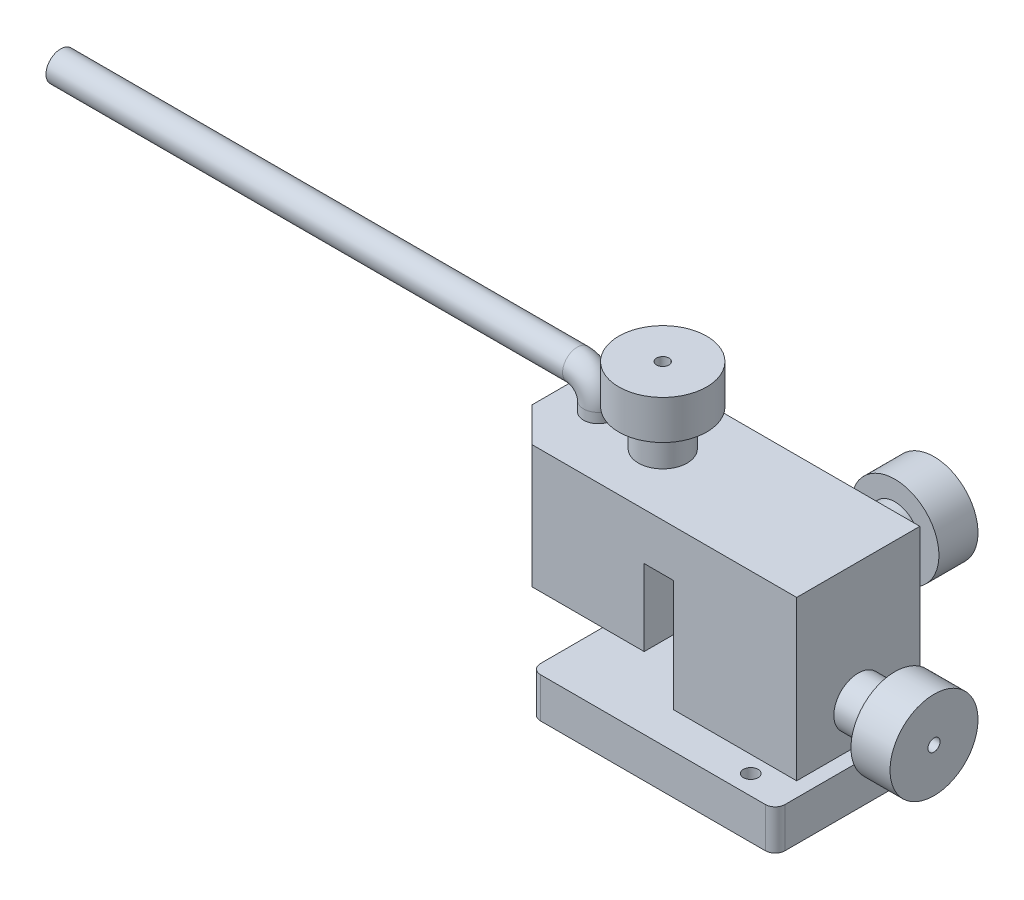
ISO-10303-21;
HEADER;
FILE_DESCRIPTION(('STEP AP214'),'2;1');
FILE_NAME('part.step','',(''),(''),'','','');
FILE_SCHEMA(('AUTOMOTIVE_DESIGN { 1 0 10303 214 1 1 1 1 }'));
ENDSEC;
DATA;
#1=APPLICATION_CONTEXT('core data for automotive mechanical design processes');
#2=APPLICATION_PROTOCOL_DEFINITION('international standard','automotive_design',2000,#1);
#3=PRODUCT_CONTEXT('',#1,'mechanical');
#4=PRODUCT('Part','Part','',(#3));
#5=PRODUCT_RELATED_PRODUCT_CATEGORY('part','',(#4));
#6=PRODUCT_DEFINITION_FORMATION('','',#4);
#7=PRODUCT_DEFINITION_CONTEXT('part definition',#1,'design');
#8=PRODUCT_DEFINITION('design','',#6,#7);
#9=PRODUCT_DEFINITION_SHAPE('','',#8);
#10=(LENGTH_UNIT() NAMED_UNIT(*) SI_UNIT(.MILLI.,.METRE.));
#11=(NAMED_UNIT(*) PLANE_ANGLE_UNIT() SI_UNIT($,.RADIAN.));
#12=(NAMED_UNIT(*) SI_UNIT($,.STERADIAN.) SOLID_ANGLE_UNIT());
#13=UNCERTAINTY_MEASURE_WITH_UNIT(LENGTH_MEASURE(1.E-05),#10,'distance_accuracy_value','');
#14=(GEOMETRIC_REPRESENTATION_CONTEXT(3) GLOBAL_UNCERTAINTY_ASSIGNED_CONTEXT((#13)) GLOBAL_UNIT_ASSIGNED_CONTEXT((#10,
#11,#12)) REPRESENTATION_CONTEXT('',''));
#15=CARTESIAN_POINT('',(0.,0.,0.));
#16=DIRECTION('',(0.,0.,1.));
#17=DIRECTION('',(1.,0.,0.));
#18=AXIS2_PLACEMENT_3D('',#15,#16,#17);
#19=CARTESIAN_POINT('',(21.8,40.7,-32.6));
#20=DIRECTION('',(1.,0.,0.));
#21=DIRECTION('',(0.,0.,-1.));
#22=AXIS2_PLACEMENT_3D('',#19,#20,#21);
#23=PLANE('',#22);
#24=DIRECTION('',(0.,0.,1.));
#25=VECTOR('',#24,1.);
#26=CARTESIAN_POINT('',(21.8,31.1,-32.6));
#27=LINE('',#26,#25);
#28=CARTESIAN_POINT('',(21.8,31.1,-32.6));
#29=VERTEX_POINT('',#28);
#30=CARTESIAN_POINT('',(21.8,31.1,-7.4));
#31=VERTEX_POINT('',#30);
#32=EDGE_CURVE('E188',#29,#31,#27,.T.);
#33=ORIENTED_EDGE('',*,*,#32,.F.);
#34=DIRECTION('',(0.,-1.,0.));
#35=VECTOR('',#34,1.);
#36=CARTESIAN_POINT('',(21.8,40.7,-32.6));
#37=LINE('',#36,#35);
#38=CARTESIAN_POINT('',(21.8,8.2,-32.6));
#39=VERTEX_POINT('',#38);
#40=EDGE_CURVE('E238',#29,#39,#37,.T.);
#41=ORIENTED_EDGE('',*,*,#40,.T.);
#42=DIRECTION('',(0.,0.,1.));
#43=VECTOR('',#42,1.);
#44=CARTESIAN_POINT('',(21.8,8.2,-32.6));
#45=LINE('',#44,#43);
#46=CARTESIAN_POINT('',(21.8,8.2,-7.4));
#47=VERTEX_POINT('',#46);
#48=EDGE_CURVE('E226',#39,#47,#45,.T.);
#49=ORIENTED_EDGE('',*,*,#48,.T.);
#50=DIRECTION('',(0.,-1.,0.));
#51=VECTOR('',#50,1.);
#52=CARTESIAN_POINT('',(21.8,40.7,-7.4));
#53=LINE('',#52,#51);
#54=EDGE_CURVE('E263',#31,#47,#53,.T.);
#55=ORIENTED_EDGE('',*,*,#54,.F.);
#56=EDGE_LOOP('',(#33,#41,#49,#55));
#57=FACE_BOUND('',#56,.T.);
#58=ADVANCED_FACE('F53',(#57),#23,.F.);
#59=CARTESIAN_POINT('',(2.,8.2,-2.));
#60=DIRECTION('',(0.,-1.,0.));
#61=DIRECTION('',(0.,0.,-1.));
#62=AXIS2_PLACEMENT_3D('',#59,#60,#61);
#63=PLANE('',#62);
#64=CARTESIAN_POINT('',(41.,8.2,-4.));
#65=DIRECTION('',(0.,-1.,0.));
#66=DIRECTION('',(0.,0.,-1.));
#67=AXIS2_PLACEMENT_3D('',#64,#65,#66);
#68=CIRCLE('',#67,1.5);
#69=CARTESIAN_POINT('',(41.,8.2,-5.5));
#70=VERTEX_POINT('',#69);
#71=EDGE_CURVE('E483',#70,#70,#68,.F.);
#72=ORIENTED_EDGE('',*,*,#71,.F.);
#73=EDGE_LOOP('',(#72));
#74=FACE_BOUND('',#73,.T.);
#75=CARTESIAN_POINT('',(41.,8.2,-36.));
#76=DIRECTION('',(0.,-1.,0.));
#77=DIRECTION('',(0.,0.,-1.));
#78=AXIS2_PLACEMENT_3D('',#75,#76,#77);
#79=CIRCLE('',#78,1.5);
#80=CARTESIAN_POINT('',(41.,8.2,-37.5));
#81=VERTEX_POINT('',#80);
#82=EDGE_CURVE('E489',#81,#81,#79,.F.);
#83=ORIENTED_EDGE('',*,*,#82,.F.);
#84=EDGE_LOOP('',(#83));
#85=FACE_BOUND('',#84,.T.);
#86=CARTESIAN_POINT('',(2.,8.2,-2.));
#87=DIRECTION('',(0.,1.,0.));
#88=DIRECTION('',(0.,0.,-1.));
#89=AXIS2_PLACEMENT_3D('',#86,#87,#88);
#90=CIRCLE('',#89,2.);
#91=CARTESIAN_POINT('',(0.,8.2,-2.00000000000001));
#92=VERTEX_POINT('',#91);
#93=CARTESIAN_POINT('',(2.00000000000001,8.2,0.));
#94=VERTEX_POINT('',#93);
#95=EDGE_CURVE('E267',#92,#94,#90,.T.);
#96=ORIENTED_EDGE('',*,*,#95,.T.);
#97=DIRECTION('',(1.,0.,0.));
#98=VECTOR('',#97,1.);
#99=CARTESIAN_POINT('',(2.00000000000001,8.2,0.));
#100=LINE('',#99,#98);
#101=CARTESIAN_POINT('',(48.,8.2,0.));
#102=VERTEX_POINT('',#101);
#103=EDGE_CURVE('E271',#94,#102,#100,.T.);
#104=ORIENTED_EDGE('',*,*,#103,.T.);
#105=CARTESIAN_POINT('',(48.,8.2,-2.));
#106=DIRECTION('',(0.,1.,0.));
#107=DIRECTION('',(0.,0.,1.));
#108=AXIS2_PLACEMENT_3D('',#105,#106,#107);
#109=CIRCLE('',#108,2.);
#110=CARTESIAN_POINT('',(50.,8.2,-2.00000000000001));
#111=VERTEX_POINT('',#110);
#112=EDGE_CURVE('E275',#102,#111,#109,.T.);
#113=ORIENTED_EDGE('',*,*,#112,.T.);
#114=DIRECTION('',(0.,0.,-1.));
#115=VECTOR('',#114,1.);
#116=CARTESIAN_POINT('',(50.,8.2,-2.00000000000001));
#117=LINE('',#116,#115);
#118=CARTESIAN_POINT('',(50.,8.2,-38.));
#119=VERTEX_POINT('',#118);
#120=EDGE_CURVE('E278',#111,#119,#117,.T.);
#121=ORIENTED_EDGE('',*,*,#120,.T.);
#122=CARTESIAN_POINT('',(48.,8.2,-38.));
#123=DIRECTION('',(0.,1.,0.));
#124=DIRECTION('',(0.,0.,-1.));
#125=AXIS2_PLACEMENT_3D('',#122,#123,#124);
#126=CIRCLE('',#125,2.);
#127=CARTESIAN_POINT('',(48.,8.2,-40.));
#128=VERTEX_POINT('',#127);
#129=EDGE_CURVE('E281',#119,#128,#126,.T.);
#130=ORIENTED_EDGE('',*,*,#129,.T.);
#131=DIRECTION('',(-1.,0.,0.));
#132=VECTOR('',#131,1.);
#133=CARTESIAN_POINT('',(2.00000000000001,8.2,-40.));
#134=LINE('',#133,#132);
#135=CARTESIAN_POINT('',(2.00000000000001,8.2,-40.));
#136=VERTEX_POINT('',#135);
#137=EDGE_CURVE('E284',#128,#136,#134,.T.);
#138=ORIENTED_EDGE('',*,*,#137,.T.);
#139=CARTESIAN_POINT('',(2.,8.2,-38.));
#140=DIRECTION('',(0.,1.,0.));
#141=DIRECTION('',(0.,0.,-1.));
#142=AXIS2_PLACEMENT_3D('',#139,#140,#141);
#143=CIRCLE('',#142,2.);
#144=CARTESIAN_POINT('',(0.,8.2,-38.));
#145=VERTEX_POINT('',#144);
#146=EDGE_CURVE('E287',#136,#145,#143,.T.);
#147=ORIENTED_EDGE('',*,*,#146,.T.);
#148=DIRECTION('',(0.,0.,1.));
#149=VECTOR('',#148,1.);
#150=CARTESIAN_POINT('',(0.,8.2,-2.00000000000001));
#151=LINE('',#150,#149);
#152=EDGE_CURVE('E290',#145,#92,#151,.T.);
#153=ORIENTED_EDGE('',*,*,#152,.T.);
#154=EDGE_LOOP('',(#96,#104,#113,#121,#130,#138,#147,#153));
#155=FACE_BOUND('',#154,.T.);
#156=ORIENTED_EDGE('',*,*,#48,.F.);
#157=DIRECTION('',(-1.,0.,0.));
#158=VECTOR('',#157,1.);
#159=CARTESIAN_POINT('',(21.8,8.2,-32.6));
#160=LINE('',#159,#158);
#161=CARTESIAN_POINT('',(47.,8.2,-32.6));
#162=VERTEX_POINT('',#161);
#163=EDGE_CURVE('E231',#162,#39,#160,.T.);
#164=ORIENTED_EDGE('',*,*,#163,.F.);
#165=DIRECTION('',(0.,0.,-1.));
#166=VECTOR('',#165,1.);
#167=CARTESIAN_POINT('',(47.,8.2,-32.6));
#168=LINE('',#167,#166);
#169=CARTESIAN_POINT('',(47.,8.2,-7.4));
#170=VERTEX_POINT('',#169);
#171=EDGE_CURVE('E246',#170,#162,#168,.T.);
#172=ORIENTED_EDGE('',*,*,#171,.F.);
#173=DIRECTION('',(1.,0.,0.));
#174=VECTOR('',#173,1.);
#175=CARTESIAN_POINT('',(21.8,8.2,-7.4));
#176=LINE('',#175,#174);
#177=EDGE_CURVE('E242',#47,#170,#176,.T.);
#178=ORIENTED_EDGE('',*,*,#177,.F.);
#179=EDGE_LOOP('',(#156,#164,#172,#178));
#180=FACE_BOUND('',#179,.T.);
#181=ADVANCED_FACE('F548',(#74,#85,#155,#180),#63,.F.);
#182=CARTESIAN_POINT('',(2.,8.2,-2.));
#183=DIRECTION('',(0.,-1.,0.));
#184=DIRECTION('',(0.,0.,-1.));
#185=AXIS2_PLACEMENT_3D('',#182,#183,#184);
#186=CYLINDRICAL_SURFACE('',#185,2.);
#187=CARTESIAN_POINT('',(2.,0.,-2.));
#188=DIRECTION('',(0.,1.,0.));
#189=DIRECTION('',(0.,0.,-1.));
#190=AXIS2_PLACEMENT_3D('',#187,#188,#189);
#191=CIRCLE('',#190,2.);
#192=CARTESIAN_POINT('',(0.,0.,-2.00000000000001));
#193=VERTEX_POINT('',#192);
#194=CARTESIAN_POINT('',(2.00000000000001,0.,0.));
#195=VERTEX_POINT('',#194);
#196=EDGE_CURVE('E266',#193,#195,#191,.T.);
#197=ORIENTED_EDGE('',*,*,#196,.T.);
#198=DIRECTION('',(0.,-1.,0.));
#199=VECTOR('',#198,1.);
#200=CARTESIAN_POINT('',(2.00000000000001,8.2,0.));
#201=LINE('',#200,#199);
#202=EDGE_CURVE('E344',#94,#195,#201,.T.);
#203=ORIENTED_EDGE('',*,*,#202,.F.);
#204=ORIENTED_EDGE('',*,*,#95,.F.);
#205=DIRECTION('',(0.,-1.,0.));
#206=VECTOR('',#205,1.);
#207=CARTESIAN_POINT('',(0.,8.2,-2.00000000000001));
#208=LINE('',#207,#206);
#209=EDGE_CURVE('E293',#92,#193,#208,.T.);
#210=ORIENTED_EDGE('',*,*,#209,.T.);
#211=EDGE_LOOP('',(#197,#203,#204,#210));
#212=FACE_BOUND('',#211,.T.);
#213=ADVANCED_FACE('F516',(#212),#186,.T.);
#214=CARTESIAN_POINT('',(2.00000000000001,8.2,0.));
#215=DIRECTION('',(0.,0.,-1.));
#216=DIRECTION('',(-1.,0.,0.));
#217=AXIS2_PLACEMENT_3D('',#214,#215,#216);
#218=PLANE('',#217);
#219=DIRECTION('',(1.,0.,0.));
#220=VECTOR('',#219,1.);
#221=CARTESIAN_POINT('',(2.00000000000001,0.,0.));
#222=LINE('',#221,#220);
#223=CARTESIAN_POINT('',(48.,0.,0.));
#224=VERTEX_POINT('',#223);
#225=EDGE_CURVE('E297',#195,#224,#222,.T.);
#226=ORIENTED_EDGE('',*,*,#225,.T.);
#227=DIRECTION('',(0.,-1.,0.));
#228=VECTOR('',#227,1.);
#229=CARTESIAN_POINT('',(48.,8.2,0.));
#230=LINE('',#229,#228);
#231=EDGE_CURVE('E340',#102,#224,#230,.T.);
#232=ORIENTED_EDGE('',*,*,#231,.F.);
#233=ORIENTED_EDGE('',*,*,#103,.F.);
#234=ORIENTED_EDGE('',*,*,#202,.T.);
#235=EDGE_LOOP('',(#226,#232,#233,#234));
#236=FACE_BOUND('',#235,.T.);
#237=ADVANCED_FACE('F546',(#236),#218,.F.);
#238=CARTESIAN_POINT('',(48.,8.2,-2.));
#239=DIRECTION('',(0.,-1.,0.));
#240=DIRECTION('',(0.,0.,-1.));
#241=AXIS2_PLACEMENT_3D('',#238,#239,#240);
#242=CYLINDRICAL_SURFACE('',#241,2.);
#243=CARTESIAN_POINT('',(48.,0.,-2.));
#244=DIRECTION('',(0.,1.,0.));
#245=DIRECTION('',(0.,0.,1.));
#246=AXIS2_PLACEMENT_3D('',#243,#244,#245);
#247=CIRCLE('',#246,2.);
#248=CARTESIAN_POINT('',(50.,0.,-2.00000000000001));
#249=VERTEX_POINT('',#248);
#250=EDGE_CURVE('E300',#224,#249,#247,.T.);
#251=ORIENTED_EDGE('',*,*,#250,.T.);
#252=DIRECTION('',(0.,-1.,0.));
#253=VECTOR('',#252,1.);
#254=CARTESIAN_POINT('',(50.,8.2,-2.00000000000001));
#255=LINE('',#254,#253);
#256=EDGE_CURVE('E336',#111,#249,#255,.T.);
#257=ORIENTED_EDGE('',*,*,#256,.F.);
#258=ORIENTED_EDGE('',*,*,#112,.F.);
#259=ORIENTED_EDGE('',*,*,#231,.T.);
#260=EDGE_LOOP('',(#251,#257,#258,#259));
#261=FACE_BOUND('',#260,.T.);
#262=ADVANCED_FACE('F542',(#261),#242,.T.);
#263=CARTESIAN_POINT('',(50.,8.2,-2.00000000000001));
#264=DIRECTION('',(-1.,0.,0.));
#265=DIRECTION('',(0.,0.,1.));
#266=AXIS2_PLACEMENT_3D('',#263,#264,#265);
#267=PLANE('',#266);
#268=DIRECTION('',(0.,0.,-1.));
#269=VECTOR('',#268,1.);
#270=CARTESIAN_POINT('',(50.,0.,-2.00000000000001));
#271=LINE('',#270,#269);
#272=CARTESIAN_POINT('',(50.,0.,-38.));
#273=VERTEX_POINT('',#272);
#274=EDGE_CURVE('E303',#249,#273,#271,.T.);
#275=ORIENTED_EDGE('',*,*,#274,.T.);
#276=DIRECTION('',(0.,-1.,0.));
#277=VECTOR('',#276,1.);
#278=CARTESIAN_POINT('',(50.,8.2,-38.));
#279=LINE('',#278,#277);
#280=EDGE_CURVE('E332',#119,#273,#279,.T.);
#281=ORIENTED_EDGE('',*,*,#280,.F.);
#282=ORIENTED_EDGE('',*,*,#120,.F.);
#283=ORIENTED_EDGE('',*,*,#256,.T.);
#284=EDGE_LOOP('',(#275,#281,#282,#283));
#285=FACE_BOUND('',#284,.T.);
#286=ADVANCED_FACE('F539',(#285),#267,.F.);
#287=CARTESIAN_POINT('',(48.,8.2,-38.));
#288=DIRECTION('',(0.,-1.,0.));
#289=DIRECTION('',(0.,0.,-1.));
#290=AXIS2_PLACEMENT_3D('',#287,#288,#289);
#291=CYLINDRICAL_SURFACE('',#290,2.);
#292=CARTESIAN_POINT('',(48.,0.,-38.));
#293=DIRECTION('',(0.,1.,0.));
#294=DIRECTION('',(0.,0.,-1.));
#295=AXIS2_PLACEMENT_3D('',#292,#293,#294);
#296=CIRCLE('',#295,2.);
#297=CARTESIAN_POINT('',(48.,0.,-40.));
#298=VERTEX_POINT('',#297);
#299=EDGE_CURVE('E306',#273,#298,#296,.T.);
#300=ORIENTED_EDGE('',*,*,#299,.T.);
#301=DIRECTION('',(0.,-1.,0.));
#302=VECTOR('',#301,1.);
#303=CARTESIAN_POINT('',(48.,8.2,-40.));
#304=LINE('',#303,#302);
#305=EDGE_CURVE('E328',#128,#298,#304,.T.);
#306=ORIENTED_EDGE('',*,*,#305,.F.);
#307=ORIENTED_EDGE('',*,*,#129,.F.);
#308=ORIENTED_EDGE('',*,*,#280,.T.);
#309=EDGE_LOOP('',(#300,#306,#307,#308));
#310=FACE_BOUND('',#309,.T.);
#311=ADVANCED_FACE('F535',(#310),#291,.T.);
#312=CARTESIAN_POINT('',(2.00000000000001,8.2,-40.));
#313=DIRECTION('',(0.,0.,1.));
#314=DIRECTION('',(1.,0.,0.));
#315=AXIS2_PLACEMENT_3D('',#312,#313,#314);
#316=PLANE('',#315);
#317=DIRECTION('',(-1.,0.,0.));
#318=VECTOR('',#317,1.);
#319=CARTESIAN_POINT('',(2.00000000000001,0.,-40.));
#320=LINE('',#319,#318);
#321=CARTESIAN_POINT('',(2.00000000000001,0.,-40.));
#322=VERTEX_POINT('',#321);
#323=EDGE_CURVE('E309',#298,#322,#320,.T.);
#324=ORIENTED_EDGE('',*,*,#323,.T.);
#325=DIRECTION('',(0.,-1.,0.));
#326=VECTOR('',#325,1.);
#327=CARTESIAN_POINT('',(2.00000000000001,8.2,-40.));
#328=LINE('',#327,#326);
#329=EDGE_CURVE('E324',#136,#322,#328,.T.);
#330=ORIENTED_EDGE('',*,*,#329,.F.);
#331=ORIENTED_EDGE('',*,*,#137,.F.);
#332=ORIENTED_EDGE('',*,*,#305,.T.);
#333=EDGE_LOOP('',(#324,#330,#331,#332));
#334=FACE_BOUND('',#333,.T.);
#335=ADVANCED_FACE('F530',(#334),#316,.F.);
#336=CARTESIAN_POINT('',(2.,8.2,-38.));
#337=DIRECTION('',(0.,-1.,0.));
#338=DIRECTION('',(0.,0.,-1.));
#339=AXIS2_PLACEMENT_3D('',#336,#337,#338);
#340=CYLINDRICAL_SURFACE('',#339,2.);
#341=CARTESIAN_POINT('',(2.,0.,-38.));
#342=DIRECTION('',(0.,1.,0.));
#343=DIRECTION('',(0.,0.,-1.));
#344=AXIS2_PLACEMENT_3D('',#341,#342,#343);
#345=CIRCLE('',#344,2.);
#346=CARTESIAN_POINT('',(0.,0.,-38.));
#347=VERTEX_POINT('',#346);
#348=EDGE_CURVE('E312',#322,#347,#345,.T.);
#349=ORIENTED_EDGE('',*,*,#348,.T.);
#350=DIRECTION('',(0.,-1.,0.));
#351=VECTOR('',#350,1.);
#352=CARTESIAN_POINT('',(0.,8.2,-38.));
#353=LINE('',#352,#351);
#354=EDGE_CURVE('E320',#145,#347,#353,.T.);
#355=ORIENTED_EDGE('',*,*,#354,.F.);
#356=ORIENTED_EDGE('',*,*,#146,.F.);
#357=ORIENTED_EDGE('',*,*,#329,.T.);
#358=EDGE_LOOP('',(#349,#355,#356,#357));
#359=FACE_BOUND('',#358,.T.);
#360=ADVANCED_FACE('F524',(#359),#340,.T.);
#361=CARTESIAN_POINT('',(0.,8.2,-2.00000000000001));
#362=DIRECTION('',(1.,0.,0.));
#363=DIRECTION('',(0.,0.,-1.));
#364=AXIS2_PLACEMENT_3D('',#361,#362,#363);
#365=PLANE('',#364);
#366=DIRECTION('',(0.,0.,1.));
#367=VECTOR('',#366,1.);
#368=CARTESIAN_POINT('',(0.,0.,-2.00000000000001));
#369=LINE('',#368,#367);
#370=EDGE_CURVE('E272',#347,#193,#369,.T.);
#371=ORIENTED_EDGE('',*,*,#370,.T.);
#372=ORIENTED_EDGE('',*,*,#209,.F.);
#373=ORIENTED_EDGE('',*,*,#152,.F.);
#374=ORIENTED_EDGE('',*,*,#354,.T.);
#375=EDGE_LOOP('',(#371,#372,#373,#374));
#376=FACE_BOUND('',#375,.T.);
#377=ADVANCED_FACE('F506',(#376),#365,.F.);
#378=CARTESIAN_POINT('',(2.,0.,-2.));
#379=DIRECTION('',(0.,-1.,0.));
#380=DIRECTION('',(0.,0.,-1.));
#381=AXIS2_PLACEMENT_3D('',#378,#379,#380);
#382=PLANE('',#381);
#383=CARTESIAN_POINT('',(41.,0.,-4.));
#384=DIRECTION('',(0.,-1.,0.));
#385=DIRECTION('',(0.,0.,-1.));
#386=AXIS2_PLACEMENT_3D('',#383,#384,#385);
#387=CIRCLE('',#386,1.5);
#388=CARTESIAN_POINT('',(41.,0.,-5.5));
#389=VERTEX_POINT('',#388);
#390=EDGE_CURVE('E488',#389,#389,#387,.T.);
#391=ORIENTED_EDGE('',*,*,#390,.F.);
#392=EDGE_LOOP('',(#391));
#393=FACE_BOUND('',#392,.T.);
#394=CARTESIAN_POINT('',(41.,0.,-36.));
#395=DIRECTION('',(0.,-1.,0.));
#396=DIRECTION('',(0.,0.,-1.));
#397=AXIS2_PLACEMENT_3D('',#394,#395,#396);
#398=CIRCLE('',#397,1.5);
#399=CARTESIAN_POINT('',(41.,0.,-37.5));
#400=VERTEX_POINT('',#399);
#401=EDGE_CURVE('E484',#400,#400,#398,.T.);
#402=ORIENTED_EDGE('',*,*,#401,.F.);
#403=EDGE_LOOP('',(#402));
#404=FACE_BOUND('',#403,.T.);
#405=ORIENTED_EDGE('',*,*,#196,.F.);
#406=ORIENTED_EDGE('',*,*,#370,.F.);
#407=ORIENTED_EDGE('',*,*,#348,.F.);
#408=ORIENTED_EDGE('',*,*,#323,.F.);
#409=ORIENTED_EDGE('',*,*,#299,.F.);
#410=ORIENTED_EDGE('',*,*,#274,.F.);
#411=ORIENTED_EDGE('',*,*,#250,.F.);
#412=ORIENTED_EDGE('',*,*,#225,.F.);
#413=EDGE_LOOP('',(#405,#406,#407,#408,#409,#410,#411,#412));
#414=FACE_BOUND('',#413,.T.);
#415=ADVANCED_FACE('F503',(#393,#404,#414),#382,.T.);
#416=CARTESIAN_POINT('',(21.8,40.7,-7.4));
#417=DIRECTION('',(0.,0.,-1.));
#418=DIRECTION('',(-1.,0.,0.));
#419=AXIS2_PLACEMENT_3D('',#416,#417,#418);
#420=PLANE('',#419);
#421=DIRECTION('',(1.,0.,0.));
#422=VECTOR('',#421,1.);
#423=CARTESIAN_POINT('',(21.8,40.7,-7.4));
#424=LINE('',#423,#422);
#425=CARTESIAN_POINT('',(-7.19999999999998,40.7,-7.4));
#426=VERTEX_POINT('',#425);
#427=CARTESIAN_POINT('',(47.,40.7,-7.4));
#428=VERTEX_POINT('',#427);
#429=EDGE_CURVE('E227',#426,#428,#424,.T.);
#430=ORIENTED_EDGE('',*,*,#429,.F.);
#431=DIRECTION('',(0.,-1.,0.));
#432=VECTOR('',#431,1.);
#433=CARTESIAN_POINT('',(-7.19999999999998,15.5,-7.4));
#434=LINE('',#433,#432);
#435=CARTESIAN_POINT('',(-7.19999999999998,15.5,-7.4));
#436=VERTEX_POINT('',#435);
#437=EDGE_CURVE('E78',#426,#436,#434,.T.);
#438=ORIENTED_EDGE('',*,*,#437,.T.);
#439=DIRECTION('',(1.,0.,0.));
#440=VECTOR('',#439,1.);
#441=CARTESIAN_POINT('',(-14.2,15.5,-7.4));
#442=LINE('',#441,#440);
#443=CARTESIAN_POINT('',(15.8,15.5,-7.4));
#444=VERTEX_POINT('',#443);
#445=EDGE_CURVE('E189',#436,#444,#442,.T.);
#446=ORIENTED_EDGE('',*,*,#445,.T.);
#447=DIRECTION('',(0.,1.,0.));
#448=VECTOR('',#447,1.);
#449=CARTESIAN_POINT('',(15.8,40.7,-7.4));
#450=LINE('',#449,#448);
#451=CARTESIAN_POINT('',(15.8,31.1,-7.4));
#452=VERTEX_POINT('',#451);
#453=EDGE_CURVE('E204',#444,#452,#450,.T.);
#454=ORIENTED_EDGE('',*,*,#453,.T.);
#455=DIRECTION('',(1.,0.,0.));
#456=VECTOR('',#455,1.);
#457=CARTESIAN_POINT('',(15.8,31.1,-7.4));
#458=LINE('',#457,#456);
#459=EDGE_CURVE('E218',#452,#31,#458,.T.);
#460=ORIENTED_EDGE('',*,*,#459,.T.);
#461=ORIENTED_EDGE('',*,*,#54,.T.);
#462=ORIENTED_EDGE('',*,*,#177,.T.);
#463=DIRECTION('',(0.,-1.,0.));
#464=VECTOR('',#463,1.);
#465=CARTESIAN_POINT('',(47.,40.7,-7.4));
#466=LINE('',#465,#464);
#467=EDGE_CURVE('E259',#428,#170,#466,.T.);
#468=ORIENTED_EDGE('',*,*,#467,.F.);
#469=EDGE_LOOP('',(#430,#438,#446,#454,#460,#461,#462,#468));
#470=FACE_BOUND('',#469,.T.);
#471=ADVANCED_FACE('F380',(#470),#420,.F.);
#472=CARTESIAN_POINT('',(47.,40.7,-32.6));
#473=DIRECTION('',(-1.,0.,0.));
#474=DIRECTION('',(0.,0.,1.));
#475=AXIS2_PLACEMENT_3D('',#472,#473,#474);
#476=PLANE('',#475);
#477=CARTESIAN_POINT('',(47.,16.,-20.));
#478=DIRECTION('',(-1.,0.,0.));
#479=DIRECTION('',(0.,0.,1.));
#480=AXIS2_PLACEMENT_3D('',#477,#478,#479);
#481=CIRCLE('',#480,5.);
#482=CARTESIAN_POINT('',(47.,16.,-15.));
#483=VERTEX_POINT('',#482);
#484=EDGE_CURVE('E63',#483,#483,#481,.F.);
#485=ORIENTED_EDGE('',*,*,#484,.F.);
#486=EDGE_LOOP('',(#485));
#487=FACE_BOUND('',#486,.T.);
#488=ORIENTED_EDGE('',*,*,#171,.T.);
#489=DIRECTION('',(0.,-1.,0.));
#490=VECTOR('',#489,1.);
#491=CARTESIAN_POINT('',(47.,40.7,-32.6));
#492=LINE('',#491,#490);
#493=CARTESIAN_POINT('',(47.,40.7,-32.6));
#494=VERTEX_POINT('',#493);
#495=EDGE_CURVE('E255',#494,#162,#492,.T.);
#496=ORIENTED_EDGE('',*,*,#495,.F.);
#497=DIRECTION('',(0.,0.,-1.));
#498=VECTOR('',#497,1.);
#499=CARTESIAN_POINT('',(47.,40.7,-32.6));
#500=LINE('',#499,#498);
#501=EDGE_CURVE('E230',#428,#494,#500,.T.);
#502=ORIENTED_EDGE('',*,*,#501,.F.);
#503=ORIENTED_EDGE('',*,*,#467,.T.);
#504=EDGE_LOOP('',(#488,#496,#502,#503));
#505=FACE_BOUND('',#504,.T.);
#506=ADVANCED_FACE('F377',(#487,#505),#476,.F.);
#507=CARTESIAN_POINT('',(21.8,40.7,-32.6));
#508=DIRECTION('',(0.,0.,1.));
#509=DIRECTION('',(1.,0.,0.));
#510=AXIS2_PLACEMENT_3D('',#507,#508,#509);
#511=PLANE('',#510);
#512=CARTESIAN_POINT('',(34.4,30.,-32.6));
#513=DIRECTION('',(0.,0.,1.));
#514=DIRECTION('',(1.,0.,0.));
#515=AXIS2_PLACEMENT_3D('',#512,#513,#514);
#516=CIRCLE('',#515,5.);
#517=CARTESIAN_POINT('',(39.4,30.,-32.6));
#518=VERTEX_POINT('',#517);
#519=EDGE_CURVE('E11',#518,#518,#516,.F.);
#520=ORIENTED_EDGE('',*,*,#519,.F.);
#521=EDGE_LOOP('',(#520));
#522=FACE_BOUND('',#521,.T.);
#523=DIRECTION('',(1.,0.,0.));
#524=VECTOR('',#523,1.);
#525=CARTESIAN_POINT('',(-14.2,15.5,-32.6));
#526=LINE('',#525,#524);
#527=CARTESIAN_POINT('',(-7.19999999999998,15.5,-32.6));
#528=VERTEX_POINT('',#527);
#529=CARTESIAN_POINT('',(15.8,15.5,-32.6));
#530=VERTEX_POINT('',#529);
#531=EDGE_CURVE('E179',#528,#530,#526,.T.);
#532=ORIENTED_EDGE('',*,*,#531,.F.);
#533=DIRECTION('',(0.,1.,0.));
#534=VECTOR('',#533,1.);
#535=CARTESIAN_POINT('',(-7.19999999999998,40.7,-32.6));
#536=LINE('',#535,#534);
#537=CARTESIAN_POINT('',(-7.19999999999998,40.7,-32.6));
#538=VERTEX_POINT('',#537);
#539=EDGE_CURVE('E369',#528,#538,#536,.T.);
#540=ORIENTED_EDGE('',*,*,#539,.T.);
#541=DIRECTION('',(-1.,0.,0.));
#542=VECTOR('',#541,1.);
#543=CARTESIAN_POINT('',(21.8,40.7,-32.6));
#544=LINE('',#543,#542);
#545=EDGE_CURVE('E234',#494,#538,#544,.T.);
#546=ORIENTED_EDGE('',*,*,#545,.F.);
#547=ORIENTED_EDGE('',*,*,#495,.T.);
#548=ORIENTED_EDGE('',*,*,#163,.T.);
#549=ORIENTED_EDGE('',*,*,#40,.F.);
#550=DIRECTION('',(1.,0.,0.));
#551=VECTOR('',#550,1.);
#552=CARTESIAN_POINT('',(15.8,31.1,-32.6));
#553=LINE('',#552,#551);
#554=CARTESIAN_POINT('',(15.8,31.1,-32.6));
#555=VERTEX_POINT('',#554);
#556=EDGE_CURVE('E196',#555,#29,#553,.T.);
#557=ORIENTED_EDGE('',*,*,#556,.F.);
#558=DIRECTION('',(0.,-1.,0.));
#559=VECTOR('',#558,1.);
#560=CARTESIAN_POINT('',(15.8,40.7,-32.6));
#561=LINE('',#560,#559);
#562=EDGE_CURVE('E193',#555,#530,#561,.T.);
#563=ORIENTED_EDGE('',*,*,#562,.T.);
#564=EDGE_LOOP('',(#532,#540,#546,#547,#548,#549,#557,#563));
#565=FACE_BOUND('',#564,.T.);
#566=ADVANCED_FACE('F194',(#522,#565),#511,.F.);
#567=CARTESIAN_POINT('',(0.,40.7,0.));
#568=DIRECTION('',(0.,1.,0.));
#569=DIRECTION('',(0.,0.,1.));
#570=AXIS2_PLACEMENT_3D('',#567,#568,#569);
#571=PLANE('',#570);
#572=CARTESIAN_POINT('',(-6.2,40.7,-20.));
#573=DIRECTION('',(0.,-1.,0.));
#574=DIRECTION('',(0.,0.,-1.));
#575=AXIS2_PLACEMENT_3D('',#572,#573,#574);
#576=CIRCLE('',#575,3.);
#577=CARTESIAN_POINT('',(-6.2,40.7,-23.));
#578=VERTEX_POINT('',#577);
#579=EDGE_CURVE('E479',#578,#578,#576,.T.);
#580=ORIENTED_EDGE('',*,*,#579,.T.);
#581=EDGE_LOOP('',(#580));
#582=FACE_BOUND('',#581,.T.);
#583=CARTESIAN_POINT('',(6.99999999999999,40.7,-20.));
#584=DIRECTION('',(0.,1.,0.));
#585=DIRECTION('',(0.,0.,1.));
#586=AXIS2_PLACEMENT_3D('',#583,#584,#585);
#587=CIRCLE('',#586,5.);
#588=CARTESIAN_POINT('',(6.99999999999999,40.7,-15.));
#589=VERTEX_POINT('',#588);
#590=EDGE_CURVE('E444',#589,#589,#587,.T.);
#591=ORIENTED_EDGE('',*,*,#590,.F.);
#592=EDGE_LOOP('',(#591));
#593=FACE_BOUND('',#592,.T.);
#594=DIRECTION('',(0.,0.,-1.));
#595=VECTOR('',#594,1.);
#596=CARTESIAN_POINT('',(-14.2,40.7,-32.6));
#597=LINE('',#596,#595);
#598=CARTESIAN_POINT('',(-14.2,40.7,-14.4));
#599=VERTEX_POINT('',#598);
#600=CARTESIAN_POINT('',(-14.2,40.7,-25.6));
#601=VERTEX_POINT('',#600);
#602=EDGE_CURVE('E213',#599,#601,#597,.T.);
#603=ORIENTED_EDGE('',*,*,#602,.F.);
#604=DIRECTION('',(0.707106781186549,0.,0.707106781186546));
#605=VECTOR('',#604,1.);
#606=CARTESIAN_POINT('',(0.100000000000021,40.7,-0.100000000000021));
#607=LINE('',#606,#605);
#608=EDGE_CURVE('E359',#599,#426,#607,.T.);
#609=ORIENTED_EDGE('',*,*,#608,.T.);
#610=ORIENTED_EDGE('',*,*,#429,.T.);
#611=ORIENTED_EDGE('',*,*,#501,.T.);
#612=ORIENTED_EDGE('',*,*,#545,.T.);
#613=DIRECTION('',(-0.707106781186549,0.,0.707106781186546));
#614=VECTOR('',#613,1.);
#615=CARTESIAN_POINT('',(-19.9,40.7,-19.9));
#616=LINE('',#615,#614);
#617=EDGE_CURVE('E356',#538,#601,#616,.T.);
#618=ORIENTED_EDGE('',*,*,#617,.T.);
#619=EDGE_LOOP('',(#603,#609,#610,#611,#612,#618));
#620=FACE_BOUND('',#619,.T.);
#621=ADVANCED_FACE('F391',(#582,#593,#620),#571,.T.);
#622=CARTESIAN_POINT('',(15.8,31.1,-32.6));
#623=DIRECTION('',(0.,1.,0.));
#624=DIRECTION('',(0.,0.,1.));
#625=AXIS2_PLACEMENT_3D('',#622,#623,#624);
#626=PLANE('',#625);
#627=ORIENTED_EDGE('',*,*,#32,.T.);
#628=ORIENTED_EDGE('',*,*,#459,.F.);
#629=DIRECTION('',(0.,0.,1.));
#630=VECTOR('',#629,1.);
#631=CARTESIAN_POINT('',(15.8,31.1,-32.6));
#632=LINE('',#631,#630);
#633=EDGE_CURVE('E215',#555,#452,#632,.T.);
#634=ORIENTED_EDGE('',*,*,#633,.F.);
#635=ORIENTED_EDGE('',*,*,#556,.T.);
#636=EDGE_LOOP('',(#627,#628,#634,#635));
#637=FACE_BOUND('',#636,.T.);
#638=ADVANCED_FACE('F557',(#637),#626,.F.);
#639=CARTESIAN_POINT('',(15.8,0.,0.));
#640=DIRECTION('',(-1.,0.,0.));
#641=DIRECTION('',(0.,0.,1.));
#642=AXIS2_PLACEMENT_3D('',#639,#640,#641);
#643=PLANE('',#642);
#644=ORIENTED_EDGE('',*,*,#562,.F.);
#645=ORIENTED_EDGE('',*,*,#633,.T.);
#646=ORIENTED_EDGE('',*,*,#453,.F.);
#647=DIRECTION('',(0.,0.,1.));
#648=VECTOR('',#647,1.);
#649=CARTESIAN_POINT('',(15.8,15.5,-32.6));
#650=LINE('',#649,#648);
#651=EDGE_CURVE('E183',#530,#444,#650,.T.);
#652=ORIENTED_EDGE('',*,*,#651,.F.);
#653=EDGE_LOOP('',(#644,#645,#646,#652));
#654=FACE_BOUND('',#653,.T.);
#655=ADVANCED_FACE('F202',(#654),#643,.F.);
#656=CARTESIAN_POINT('',(-14.2,15.5,-32.6));
#657=DIRECTION('',(0.,1.,0.));
#658=DIRECTION('',(0.,0.,1.));
#659=AXIS2_PLACEMENT_3D('',#656,#657,#658);
#660=PLANE('',#659);
#661=ORIENTED_EDGE('',*,*,#445,.F.);
#662=DIRECTION('',(-0.707106781186549,0.,-0.707106781186546));
#663=VECTOR('',#662,1.);
#664=CARTESIAN_POINT('',(-14.2,15.5,-14.4));
#665=LINE('',#664,#663);
#666=CARTESIAN_POINT('',(-14.2,15.5,-14.4));
#667=VERTEX_POINT('',#666);
#668=EDGE_CURVE('E366',#436,#667,#665,.T.);
#669=ORIENTED_EDGE('',*,*,#668,.T.);
#670=DIRECTION('',(0.,0.,1.));
#671=VECTOR('',#670,1.);
#672=CARTESIAN_POINT('',(-14.2,15.5,-32.6));
#673=LINE('',#672,#671);
#674=CARTESIAN_POINT('',(-14.2,15.5,-25.6));
#675=VERTEX_POINT('',#674);
#676=EDGE_CURVE('E208',#675,#667,#673,.T.);
#677=ORIENTED_EDGE('',*,*,#676,.F.);
#678=DIRECTION('',(0.707106781186549,0.,-0.707106781186546));
#679=VECTOR('',#678,1.);
#680=CARTESIAN_POINT('',(-14.2,15.5,-25.6));
#681=LINE('',#680,#679);
#682=EDGE_CURVE('E70',#675,#528,#681,.T.);
#683=ORIENTED_EDGE('',*,*,#682,.T.);
#684=ORIENTED_EDGE('',*,*,#531,.T.);
#685=ORIENTED_EDGE('',*,*,#651,.T.);
#686=EDGE_LOOP('',(#661,#669,#677,#683,#684,#685));
#687=FACE_BOUND('',#686,.T.);
#688=ADVANCED_FACE('F181',(#687),#660,.F.);
#689=CARTESIAN_POINT('',(-14.2,0.,0.));
#690=DIRECTION('',(-1.,0.,0.));
#691=DIRECTION('',(0.,0.,1.));
#692=AXIS2_PLACEMENT_3D('',#689,#690,#691);
#693=PLANE('',#692);
#694=ORIENTED_EDGE('',*,*,#676,.T.);
#695=DIRECTION('',(0.,1.,0.));
#696=VECTOR('',#695,1.);
#697=CARTESIAN_POINT('',(-14.2,40.7,-14.4));
#698=LINE('',#697,#696);
#699=EDGE_CURVE('E352',#667,#599,#698,.T.);
#700=ORIENTED_EDGE('',*,*,#699,.T.);
#701=ORIENTED_EDGE('',*,*,#602,.T.);
#702=DIRECTION('',(0.,-1.,0.));
#703=VECTOR('',#702,1.);
#704=CARTESIAN_POINT('',(-14.2,15.5,-25.6));
#705=LINE('',#704,#703);
#706=EDGE_CURVE('E348',#601,#675,#705,.T.);
#707=ORIENTED_EDGE('',*,*,#706,.T.);
#708=EDGE_LOOP('',(#694,#700,#701,#707));
#709=FACE_BOUND('',#708,.T.);
#710=ADVANCED_FACE('F397',(#709),#693,.T.);
#711=CARTESIAN_POINT('',(-14.2,0.,-14.4));
#712=DIRECTION('',(-0.707106781186546,0.,0.707106781186549));
#713=DIRECTION('',(0.,-1.,0.));
#714=AXIS2_PLACEMENT_3D('',#711,#712,#713);
#715=PLANE('',#714);
#716=ORIENTED_EDGE('',*,*,#668,.F.);
#717=ORIENTED_EDGE('',*,*,#437,.F.);
#718=ORIENTED_EDGE('',*,*,#608,.F.);
#719=ORIENTED_EDGE('',*,*,#699,.F.);
#720=EDGE_LOOP('',(#716,#717,#718,#719));
#721=FACE_BOUND('',#720,.T.);
#722=ADVANCED_FACE('F559',(#721),#715,.T.);
#723=CARTESIAN_POINT('',(-14.2,0.,-25.6));
#724=DIRECTION('',(-0.707106781186546,0.,-0.707106781186549));
#725=DIRECTION('',(0.,1.,0.));
#726=AXIS2_PLACEMENT_3D('',#723,#724,#725);
#727=PLANE('',#726);
#728=ORIENTED_EDGE('',*,*,#617,.F.);
#729=ORIENTED_EDGE('',*,*,#539,.F.);
#730=ORIENTED_EDGE('',*,*,#682,.F.);
#731=ORIENTED_EDGE('',*,*,#706,.F.);
#732=EDGE_LOOP('',(#728,#729,#730,#731));
#733=FACE_BOUND('',#732,.T.);
#734=ADVANCED_FACE('F56',(#733),#727,.T.);
#735=CARTESIAN_POINT('',(54.5,16.,-20.));
#736=DIRECTION('',(-1.,0.,0.));
#737=DIRECTION('',(0.,0.,1.));
#738=AXIS2_PLACEMENT_3D('',#735,#736,#737);
#739=CYLINDRICAL_SURFACE('',#738,5.);
#740=CARTESIAN_POINT('',(54.5,16.,-20.));
#741=DIRECTION('',(1.,0.,0.));
#742=DIRECTION('',(0.,0.,-1.));
#743=AXIS2_PLACEMENT_3D('',#740,#741,#742);
#744=CIRCLE('',#743,5.);
#745=CARTESIAN_POINT('',(54.5,16.,-25.));
#746=VERTEX_POINT('',#745);
#747=EDGE_CURVE('E200',#746,#746,#744,.T.);
#748=ORIENTED_EDGE('',*,*,#747,.F.);
#749=EDGE_LOOP('',(#748));
#750=FACE_BOUND('',#749,.T.);
#751=ORIENTED_EDGE('',*,*,#484,.T.);
#752=EDGE_LOOP('',(#751));
#753=FACE_BOUND('',#752,.T.);
#754=ADVANCED_FACE('F375',(#750,#753),#739,.T.);
#755=CARTESIAN_POINT('',(62.5,16.,-20.));
#756=DIRECTION('',(-1.,0.,0.));
#757=DIRECTION('',(0.,0.,1.));
#758=AXIS2_PLACEMENT_3D('',#755,#756,#757);
#759=CYLINDRICAL_SURFACE('',#758,9.);
#760=CARTESIAN_POINT('',(62.5,16.,-20.));
#761=DIRECTION('',(1.,0.,0.));
#762=DIRECTION('',(0.,0.,-1.));
#763=AXIS2_PLACEMENT_3D('',#760,#761,#762);
#764=CIRCLE('',#763,9.);
#765=CARTESIAN_POINT('',(62.5,16.,-29.));
#766=VERTEX_POINT('',#765);
#767=EDGE_CURVE('E407',#766,#766,#764,.T.);
#768=ORIENTED_EDGE('',*,*,#767,.F.);
#769=EDGE_LOOP('',(#768));
#770=FACE_BOUND('',#769,.T.);
#771=CARTESIAN_POINT('',(54.5,16.,-20.));
#772=DIRECTION('',(1.,0.,0.));
#773=DIRECTION('',(0.,0.,-1.));
#774=AXIS2_PLACEMENT_3D('',#771,#772,#773);
#775=CIRCLE('',#774,9.);
#776=CARTESIAN_POINT('',(54.5,16.,-29.));
#777=VERTEX_POINT('',#776);
#778=EDGE_CURVE('E408',#777,#777,#775,.T.);
#779=ORIENTED_EDGE('',*,*,#778,.T.);
#780=EDGE_LOOP('',(#779));
#781=FACE_BOUND('',#780,.T.);
#782=ADVANCED_FACE('F727',(#770,#781),#759,.T.);
#783=CARTESIAN_POINT('',(62.5,16.,-20.));
#784=DIRECTION('',(1.,0.,0.));
#785=DIRECTION('',(0.,0.,-1.));
#786=AXIS2_PLACEMENT_3D('',#783,#784,#785);
#787=PLANE('',#786);
#788=CARTESIAN_POINT('',(62.5,16.,-20.));
#789=DIRECTION('',(1.,0.,0.));
#790=DIRECTION('',(0.,0.,-1.));
#791=AXIS2_PLACEMENT_3D('',#788,#789,#790);
#792=CIRCLE('',#791,1.25);
#793=CARTESIAN_POINT('',(62.5,16.,-21.25));
#794=VERTEX_POINT('',#793);
#795=EDGE_CURVE('E416',#794,#794,#792,.T.);
#796=ORIENTED_EDGE('',*,*,#795,.F.);
#797=EDGE_LOOP('',(#796));
#798=FACE_BOUND('',#797,.T.);
#799=ORIENTED_EDGE('',*,*,#767,.T.);
#800=EDGE_LOOP('',(#799));
#801=FACE_BOUND('',#800,.T.);
#802=ADVANCED_FACE('F736',(#798,#801),#787,.T.);
#803=CARTESIAN_POINT('',(54.5,16.,-20.));
#804=DIRECTION('',(1.,0.,0.));
#805=DIRECTION('',(0.,0.,-1.));
#806=AXIS2_PLACEMENT_3D('',#803,#804,#805);
#807=PLANE('',#806);
#808=ORIENTED_EDGE('',*,*,#747,.T.);
#809=EDGE_LOOP('',(#808));
#810=FACE_BOUND('',#809,.T.);
#811=ORIENTED_EDGE('',*,*,#778,.F.);
#812=EDGE_LOOP('',(#811));
#813=FACE_BOUND('',#812,.T.);
#814=ADVANCED_FACE('F743',(#810,#813),#807,.F.);
#815=CARTESIAN_POINT('',(58.5,16.,-20.));
#816=DIRECTION('',(1.,0.,0.));
#817=DIRECTION('',(0.,0.,-1.));
#818=AXIS2_PLACEMENT_3D('',#815,#816,#817);
#819=CYLINDRICAL_SURFACE('',#818,1.25);
#820=CARTESIAN_POINT('',(58.5,16.,-20.));
#821=DIRECTION('',(1.,0.,0.));
#822=DIRECTION('',(0.,0.,-1.));
#823=AXIS2_PLACEMENT_3D('',#820,#821,#822);
#824=CIRCLE('',#823,1.25);
#825=CARTESIAN_POINT('',(58.5,16.,-21.25));
#826=VERTEX_POINT('',#825);
#827=EDGE_CURVE('E412',#826,#826,#824,.T.);
#828=ORIENTED_EDGE('',*,*,#827,.F.);
#829=EDGE_LOOP('',(#828));
#830=FACE_BOUND('',#829,.T.);
#831=ORIENTED_EDGE('',*,*,#795,.T.);
#832=EDGE_LOOP('',(#831));
#833=FACE_BOUND('',#832,.T.);
#834=ADVANCED_FACE('F747',(#830,#833),#819,.F.);
#835=CARTESIAN_POINT('',(58.5,16.,-20.));
#836=DIRECTION('',(1.,0.,0.));
#837=DIRECTION('',(0.,0.,-1.));
#838=AXIS2_PLACEMENT_3D('',#835,#836,#837);
#839=PLANE('',#838);
#840=ORIENTED_EDGE('',*,*,#827,.T.);
#841=EDGE_LOOP('',(#840));
#842=FACE_BOUND('',#841,.T.);
#843=ADVANCED_FACE('F763',(#842),#839,.T.);
#844=CARTESIAN_POINT('',(34.4,30.,-40.1));
#845=DIRECTION('',(0.,0.,1.));
#846=DIRECTION('',(1.,0.,0.));
#847=AXIS2_PLACEMENT_3D('',#844,#845,#846);
#848=CYLINDRICAL_SURFACE('',#847,5.);
#849=CARTESIAN_POINT('',(34.4,30.,-40.1));
#850=DIRECTION('',(0.,0.,-1.));
#851=DIRECTION('',(-1.,0.,0.));
#852=AXIS2_PLACEMENT_3D('',#849,#850,#851);
#853=CIRCLE('',#852,5.);
#854=CARTESIAN_POINT('',(29.4,30.,-40.1));
#855=VERTEX_POINT('',#854);
#856=EDGE_CURVE('E420',#855,#855,#853,.T.);
#857=ORIENTED_EDGE('',*,*,#856,.F.);
#858=EDGE_LOOP('',(#857));
#859=FACE_BOUND('',#858,.T.);
#860=ORIENTED_EDGE('',*,*,#519,.T.);
#861=EDGE_LOOP('',(#860));
#862=FACE_BOUND('',#861,.T.);
#863=ADVANCED_FACE('F772',(#859,#862),#848,.T.);
#864=CARTESIAN_POINT('',(34.4,30.,-48.1));
#865=DIRECTION('',(0.,0.,1.));
#866=DIRECTION('',(1.,0.,0.));
#867=AXIS2_PLACEMENT_3D('',#864,#865,#866);
#868=CYLINDRICAL_SURFACE('',#867,9.);
#869=CARTESIAN_POINT('',(34.4,30.,-48.1));
#870=DIRECTION('',(0.,0.,-1.));
#871=DIRECTION('',(-1.,0.,0.));
#872=AXIS2_PLACEMENT_3D('',#869,#870,#871);
#873=CIRCLE('',#872,9.);
#874=CARTESIAN_POINT('',(25.4,30.,-48.1));
#875=VERTEX_POINT('',#874);
#876=EDGE_CURVE('E427',#875,#875,#873,.T.);
#877=ORIENTED_EDGE('',*,*,#876,.F.);
#878=EDGE_LOOP('',(#877));
#879=FACE_BOUND('',#878,.T.);
#880=CARTESIAN_POINT('',(34.4,30.,-40.1));
#881=DIRECTION('',(0.,0.,-1.));
#882=DIRECTION('',(-1.,0.,0.));
#883=AXIS2_PLACEMENT_3D('',#880,#881,#882);
#884=CIRCLE('',#883,9.);
#885=CARTESIAN_POINT('',(25.4,30.,-40.1));
#886=VERTEX_POINT('',#885);
#887=EDGE_CURVE('E428',#886,#886,#884,.T.);
#888=ORIENTED_EDGE('',*,*,#887,.T.);
#889=EDGE_LOOP('',(#888));
#890=FACE_BOUND('',#889,.T.);
#891=ADVANCED_FACE('F791',(#879,#890),#868,.T.);
#892=CARTESIAN_POINT('',(34.4,30.,-48.1));
#893=DIRECTION('',(0.,0.,-1.));
#894=DIRECTION('',(-1.,0.,0.));
#895=AXIS2_PLACEMENT_3D('',#892,#893,#894);
#896=PLANE('',#895);
#897=CARTESIAN_POINT('',(34.4,30.,-48.1));
#898=DIRECTION('',(0.,0.,-1.));
#899=DIRECTION('',(-1.,0.,0.));
#900=AXIS2_PLACEMENT_3D('',#897,#898,#899);
#901=CIRCLE('',#900,1.25);
#902=CARTESIAN_POINT('',(33.15,30.,-48.1));
#903=VERTEX_POINT('',#902);
#904=EDGE_CURVE('E436',#903,#903,#901,.T.);
#905=ORIENTED_EDGE('',*,*,#904,.F.);
#906=EDGE_LOOP('',(#905));
#907=FACE_BOUND('',#906,.T.);
#908=ORIENTED_EDGE('',*,*,#876,.T.);
#909=EDGE_LOOP('',(#908));
#910=FACE_BOUND('',#909,.T.);
#911=ADVANCED_FACE('F800',(#907,#910),#896,.T.);
#912=CARTESIAN_POINT('',(34.4,30.,-40.1));
#913=DIRECTION('',(0.,0.,-1.));
#914=DIRECTION('',(-1.,0.,0.));
#915=AXIS2_PLACEMENT_3D('',#912,#913,#914);
#916=PLANE('',#915);
#917=ORIENTED_EDGE('',*,*,#856,.T.);
#918=EDGE_LOOP('',(#917));
#919=FACE_BOUND('',#918,.T.);
#920=ORIENTED_EDGE('',*,*,#887,.F.);
#921=EDGE_LOOP('',(#920));
#922=FACE_BOUND('',#921,.T.);
#923=ADVANCED_FACE('F807',(#919,#922),#916,.F.);
#924=CARTESIAN_POINT('',(34.4,30.,-44.1));
#925=DIRECTION('',(0.,0.,-1.));
#926=DIRECTION('',(-1.,0.,0.));
#927=AXIS2_PLACEMENT_3D('',#924,#925,#926);
#928=CYLINDRICAL_SURFACE('',#927,1.25);
#929=CARTESIAN_POINT('',(34.4,30.,-44.1));
#930=DIRECTION('',(0.,0.,-1.));
#931=DIRECTION('',(-1.,0.,0.));
#932=AXIS2_PLACEMENT_3D('',#929,#930,#931);
#933=CIRCLE('',#932,1.25);
#934=CARTESIAN_POINT('',(33.15,30.,-44.1));
#935=VERTEX_POINT('',#934);
#936=EDGE_CURVE('E432',#935,#935,#933,.T.);
#937=ORIENTED_EDGE('',*,*,#936,.F.);
#938=EDGE_LOOP('',(#937));
#939=FACE_BOUND('',#938,.T.);
#940=ORIENTED_EDGE('',*,*,#904,.T.);
#941=EDGE_LOOP('',(#940));
#942=FACE_BOUND('',#941,.T.);
#943=ADVANCED_FACE('F811',(#939,#942),#928,.F.);
#944=CARTESIAN_POINT('',(34.4,30.,-44.1));
#945=DIRECTION('',(0.,0.,-1.));
#946=DIRECTION('',(-1.,0.,0.));
#947=AXIS2_PLACEMENT_3D('',#944,#945,#946);
#948=PLANE('',#947);
#949=ORIENTED_EDGE('',*,*,#936,.T.);
#950=EDGE_LOOP('',(#949));
#951=FACE_BOUND('',#950,.T.);
#952=ADVANCED_FACE('F827',(#951),#948,.T.);
#953=CARTESIAN_POINT('',(6.99999999999999,48.2,-20.));
#954=DIRECTION('',(0.,-1.,0.));
#955=DIRECTION('',(0.,0.,-1.));
#956=AXIS2_PLACEMENT_3D('',#953,#954,#955);
#957=CYLINDRICAL_SURFACE('',#956,5.);
#958=CARTESIAN_POINT('',(6.99999999999999,48.2,-20.));
#959=DIRECTION('',(0.,1.,0.));
#960=DIRECTION('',(0.,0.,1.));
#961=AXIS2_PLACEMENT_3D('',#958,#959,#960);
#962=CIRCLE('',#961,5.);
#963=CARTESIAN_POINT('',(6.99999999999999,48.2,-15.));
#964=VERTEX_POINT('',#963);
#965=EDGE_CURVE('E440',#964,#964,#962,.T.);
#966=ORIENTED_EDGE('',*,*,#965,.F.);
#967=EDGE_LOOP('',(#966));
#968=FACE_BOUND('',#967,.T.);
#969=ORIENTED_EDGE('',*,*,#590,.T.);
#970=EDGE_LOOP('',(#969));
#971=FACE_BOUND('',#970,.T.);
#972=ADVANCED_FACE('F836',(#968,#971),#957,.T.);
#973=CARTESIAN_POINT('',(6.99999999999999,56.2,-20.));
#974=DIRECTION('',(0.,-1.,0.));
#975=DIRECTION('',(0.,0.,-1.));
#976=AXIS2_PLACEMENT_3D('',#973,#974,#975);
#977=CYLINDRICAL_SURFACE('',#976,9.);
#978=CARTESIAN_POINT('',(6.99999999999999,56.2,-20.));
#979=DIRECTION('',(0.,1.,0.));
#980=DIRECTION('',(0.,0.,1.));
#981=AXIS2_PLACEMENT_3D('',#978,#979,#980);
#982=CIRCLE('',#981,9.);
#983=CARTESIAN_POINT('',(6.99999999999999,56.2,-11.));
#984=VERTEX_POINT('',#983);
#985=EDGE_CURVE('E448',#984,#984,#982,.T.);
#986=ORIENTED_EDGE('',*,*,#985,.F.);
#987=EDGE_LOOP('',(#986));
#988=FACE_BOUND('',#987,.T.);
#989=CARTESIAN_POINT('',(6.99999999999999,48.2,-20.));
#990=DIRECTION('',(0.,1.,0.));
#991=DIRECTION('',(0.,0.,1.));
#992=AXIS2_PLACEMENT_3D('',#989,#990,#991);
#993=CIRCLE('',#992,9.);
#994=CARTESIAN_POINT('',(6.99999999999999,48.2,-11.));
#995=VERTEX_POINT('',#994);
#996=EDGE_CURVE('E452',#995,#995,#993,.T.);
#997=ORIENTED_EDGE('',*,*,#996,.T.);
#998=EDGE_LOOP('',(#997));
#999=FACE_BOUND('',#998,.T.);
#1000=ADVANCED_FACE('F845',(#988,#999),#977,.T.);
#1001=CARTESIAN_POINT('',(6.99999999999999,56.2,-20.));
#1002=DIRECTION('',(0.,1.,0.));
#1003=DIRECTION('',(0.,0.,1.));
#1004=AXIS2_PLACEMENT_3D('',#1001,#1002,#1003);
#1005=PLANE('',#1004);
#1006=CARTESIAN_POINT('',(6.99999999999999,56.2,-20.));
#1007=DIRECTION('',(0.,1.,0.));
#1008=DIRECTION('',(0.,0.,1.));
#1009=AXIS2_PLACEMENT_3D('',#1006,#1007,#1008);
#1010=CIRCLE('',#1009,1.25);
#1011=CARTESIAN_POINT('',(6.99999999999999,56.2,-18.75));
#1012=VERTEX_POINT('',#1011);
#1013=EDGE_CURVE('E460',#1012,#1012,#1010,.T.);
#1014=ORIENTED_EDGE('',*,*,#1013,.F.);
#1015=EDGE_LOOP('',(#1014));
#1016=FACE_BOUND('',#1015,.T.);
#1017=ORIENTED_EDGE('',*,*,#985,.T.);
#1018=EDGE_LOOP('',(#1017));
#1019=FACE_BOUND('',#1018,.T.);
#1020=ADVANCED_FACE('F854',(#1016,#1019),#1005,.T.);
#1021=CARTESIAN_POINT('',(6.99999999999999,48.2,-20.));
#1022=DIRECTION('',(0.,1.,0.));
#1023=DIRECTION('',(0.,0.,1.));
#1024=AXIS2_PLACEMENT_3D('',#1021,#1022,#1023);
#1025=PLANE('',#1024);
#1026=ORIENTED_EDGE('',*,*,#965,.T.);
#1027=EDGE_LOOP('',(#1026));
#1028=FACE_BOUND('',#1027,.T.);
#1029=ORIENTED_EDGE('',*,*,#996,.F.);
#1030=EDGE_LOOP('',(#1029));
#1031=FACE_BOUND('',#1030,.T.);
#1032=ADVANCED_FACE('F861',(#1028,#1031),#1025,.F.);
#1033=CARTESIAN_POINT('',(6.99999999999999,52.2,-20.));
#1034=DIRECTION('',(0.,1.,0.));
#1035=DIRECTION('',(0.,0.,1.));
#1036=AXIS2_PLACEMENT_3D('',#1033,#1034,#1035);
#1037=CYLINDRICAL_SURFACE('',#1036,1.25);
#1038=CARTESIAN_POINT('',(6.99999999999999,52.2,-20.));
#1039=DIRECTION('',(0.,1.,0.));
#1040=DIRECTION('',(0.,0.,1.));
#1041=AXIS2_PLACEMENT_3D('',#1038,#1039,#1040);
#1042=CIRCLE('',#1041,1.25);
#1043=CARTESIAN_POINT('',(6.99999999999999,52.2,-18.75));
#1044=VERTEX_POINT('',#1043);
#1045=EDGE_CURVE('E456',#1044,#1044,#1042,.T.);
#1046=ORIENTED_EDGE('',*,*,#1045,.F.);
#1047=EDGE_LOOP('',(#1046));
#1048=FACE_BOUND('',#1047,.T.);
#1049=ORIENTED_EDGE('',*,*,#1013,.T.);
#1050=EDGE_LOOP('',(#1049));
#1051=FACE_BOUND('',#1050,.T.);
#1052=ADVANCED_FACE('F865',(#1048,#1051),#1037,.F.);
#1053=CARTESIAN_POINT('',(6.99999999999999,52.2,-20.));
#1054=DIRECTION('',(0.,1.,0.));
#1055=DIRECTION('',(0.,0.,1.));
#1056=AXIS2_PLACEMENT_3D('',#1053,#1054,#1055);
#1057=PLANE('',#1056);
#1058=ORIENTED_EDGE('',*,*,#1045,.T.);
#1059=EDGE_LOOP('',(#1058));
#1060=FACE_BOUND('',#1059,.T.);
#1061=ADVANCED_FACE('F881',(#1060),#1057,.T.);
#1062=CARTESIAN_POINT('',(-116.2,47.,-20.));
#1063=DIRECTION('',(1.,0.,0.));
#1064=DIRECTION('',(0.,0.,-1.));
#1065=AXIS2_PLACEMENT_3D('',#1062,#1063,#1064);
#1066=PLANE('',#1065);
#1067=CARTESIAN_POINT('',(-116.2,47.,-20.));
#1068=DIRECTION('',(1.,0.,0.));
#1069=DIRECTION('',(0.,0.,-1.));
#1070=AXIS2_PLACEMENT_3D('',#1067,#1068,#1069);
#1071=CIRCLE('',#1070,3.);
#1072=CARTESIAN_POINT('',(-116.2,47.,-23.));
#1073=VERTEX_POINT('',#1072);
#1074=EDGE_CURVE('E464',#1073,#1073,#1071,.T.);
#1075=ORIENTED_EDGE('',*,*,#1074,.F.);
#1076=EDGE_LOOP('',(#1075));
#1077=FACE_BOUND('',#1076,.T.);
#1078=ADVANCED_FACE('F890',(#1077),#1066,.F.);
#1079=CARTESIAN_POINT('',(-6.2,40.7,-20.));
#1080=DIRECTION('',(0.,1.,0.));
#1081=DIRECTION('',(0.,0.,1.));
#1082=AXIS2_PLACEMENT_3D('',#1079,#1080,#1081);
#1083=CYLINDRICAL_SURFACE('',#1082,3.);
#1084=CARTESIAN_POINT('',(-6.2,42.7,-20.));
#1085=DIRECTION('',(0.,-1.,0.));
#1086=DIRECTION('',(0.,0.,-1.));
#1087=AXIS2_PLACEMENT_3D('',#1084,#1085,#1086);
#1088=CIRCLE('',#1087,3.);
#1089=CARTESIAN_POINT('',(-3.20000000000001,42.7,-20.));
#1090=VERTEX_POINT('',#1089);
#1091=EDGE_CURVE('E475',#1090,#1090,#1088,.T.);
#1092=ORIENTED_EDGE('',*,*,#1091,.T.);
#1093=EDGE_LOOP('',(#1092));
#1094=FACE_BOUND('',#1093,.T.);
#1095=ORIENTED_EDGE('',*,*,#579,.F.);
#1096=EDGE_LOOP('',(#1095));
#1097=FACE_BOUND('',#1096,.T.);
#1098=ADVANCED_FACE('F911',(#1094,#1097),#1083,.T.);
#1099=CARTESIAN_POINT('',(-10.5,42.7,-20.));
#1100=DIRECTION('',(0.,0.,1.));
#1101=DIRECTION('',(1.,0.,0.));
#1102=AXIS2_PLACEMENT_3D('',#1099,#1100,#1101);
#1103=TOROIDAL_SURFACE('',#1102,4.3,3.);
#1104=CARTESIAN_POINT('',(-10.5,47.,-20.));
#1105=DIRECTION('',(1.,0.,0.));
#1106=DIRECTION('',(0.,0.,-1.));
#1107=AXIS2_PLACEMENT_3D('',#1104,#1105,#1106);
#1108=CIRCLE('',#1107,3.);
#1109=CARTESIAN_POINT('',(-10.5,50.,-20.));
#1110=VERTEX_POINT('',#1109);
#1111=EDGE_CURVE('E471',#1110,#1110,#1108,.T.);
#1112=CARTESIAN_POINT('',(-10.5,42.7,-20.));
#1113=DIRECTION('',(0.,0.,1.));
#1114=DIRECTION('',(1.,0.,0.));
#1115=AXIS2_PLACEMENT_3D('',#1112,#1113,#1114);
#1116=CIRCLE('',#1115,7.3);
#1117=EDGE_CURVE('',#1090,#1110,#1116,.T.);
#1118=ORIENTED_EDGE('',*,*,#1091,.F.);
#1119=ORIENTED_EDGE('',*,*,#1111,.T.);
#1120=ORIENTED_EDGE('',*,*,#1117,.T.);
#1121=ORIENTED_EDGE('',*,*,#1117,.F.);
#1122=EDGE_LOOP('',(#1118,#1120,#1119,#1121));
#1123=FACE_BOUND('',#1122,.T.);
#1124=ADVANCED_FACE('F925',(#1123),#1103,.T.);
#1125=CARTESIAN_POINT('',(-10.5,47.,-20.));
#1126=DIRECTION('',(-1.,0.,0.));
#1127=DIRECTION('',(0.,-1.,0.));
#1128=AXIS2_PLACEMENT_3D('',#1125,#1126,#1127);
#1129=CYLINDRICAL_SURFACE('',#1128,3.);
#1130=ORIENTED_EDGE('',*,*,#1074,.T.);
#1131=EDGE_LOOP('',(#1130));
#1132=FACE_BOUND('',#1131,.T.);
#1133=ORIENTED_EDGE('',*,*,#1111,.F.);
#1134=EDGE_LOOP('',(#1133));
#1135=FACE_BOUND('',#1134,.T.);
#1136=ADVANCED_FACE('F893',(#1132,#1135),#1129,.T.);
#1137=CARTESIAN_POINT('',(41.,56.201,-36.));
#1138=DIRECTION('',(0.,-1.,0.));
#1139=DIRECTION('',(0.,0.,-1.));
#1140=AXIS2_PLACEMENT_3D('',#1137,#1138,#1139);
#1141=CYLINDRICAL_SURFACE('',#1140,1.5);
#1142=ORIENTED_EDGE('',*,*,#401,.T.);
#1143=EDGE_LOOP('',(#1142));
#1144=FACE_BOUND('',#1143,.T.);
#1145=ORIENTED_EDGE('',*,*,#82,.T.);
#1146=EDGE_LOOP('',(#1145));
#1147=FACE_BOUND('',#1146,.T.);
#1148=ADVANCED_FACE('F914',(#1144,#1147),#1141,.F.);
#1149=CARTESIAN_POINT('',(41.,56.201,-4.));
#1150=DIRECTION('',(0.,-1.,0.));
#1151=DIRECTION('',(0.,0.,-1.));
#1152=AXIS2_PLACEMENT_3D('',#1149,#1150,#1151);
#1153=CYLINDRICAL_SURFACE('',#1152,1.5);
#1154=ORIENTED_EDGE('',*,*,#390,.T.);
#1155=EDGE_LOOP('',(#1154));
#1156=FACE_BOUND('',#1155,.T.);
#1157=ORIENTED_EDGE('',*,*,#71,.T.);
#1158=EDGE_LOOP('',(#1157));
#1159=FACE_BOUND('',#1158,.T.);
#1160=ADVANCED_FACE('F500',(#1156,#1159),#1153,.F.);
#1161=CLOSED_SHELL('',(#58,#181,#213,#237,#262,#286,#311,#335,#360,#377,#415,#471,#506,#566,
#621,#638,#655,#688,#710,#722,#734,#754,#782,#802,#814,#834,#843,#863,#891,#911,#923,#943,#952,
#972,#1000,#1020,#1032,#1052,#1061,#1078,#1098,#1124,#1136,#1148,#1160));
#1162=MANIFOLD_SOLID_BREP('B2',#1161);
#1163=ADVANCED_BREP_SHAPE_REPRESENTATION('',(#18,#1162),#14);
#1164=SHAPE_DEFINITION_REPRESENTATION(#9,#1163);
ENDSEC;
END-ISO-10303-21;
